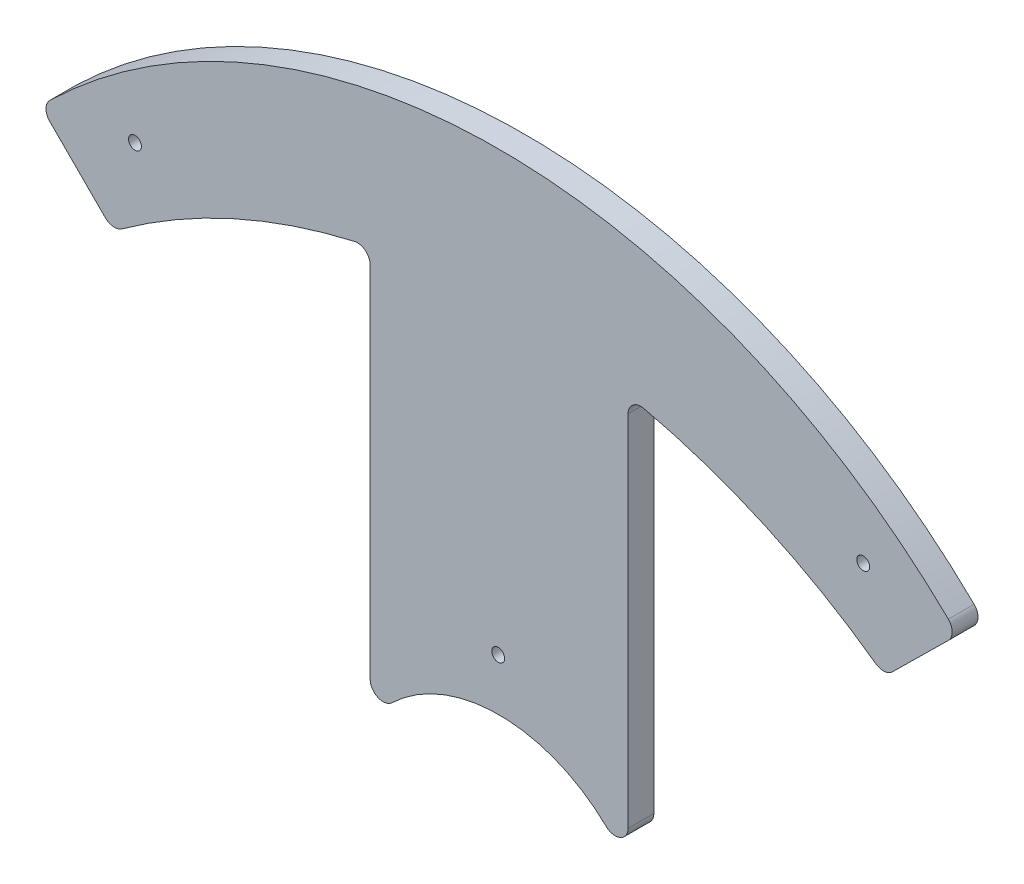
ISO-10303-21;
HEADER;
FILE_DESCRIPTION(('STEP AP214'),'2;1');
FILE_NAME('part.step','',(''),(''),'','','');
FILE_SCHEMA(('AUTOMOTIVE_DESIGN { 1 0 10303 214 1 1 1 1 }'));
ENDSEC;
DATA;
#1=APPLICATION_CONTEXT('core data for automotive mechanical design processes');
#2=APPLICATION_PROTOCOL_DEFINITION('international standard','automotive_design',2000,#1);
#3=PRODUCT_CONTEXT('',#1,'mechanical');
#4=PRODUCT('Part','Part','',(#3));
#5=PRODUCT_RELATED_PRODUCT_CATEGORY('part','',(#4));
#6=PRODUCT_DEFINITION_FORMATION('','',#4);
#7=PRODUCT_DEFINITION_CONTEXT('part definition',#1,'design');
#8=PRODUCT_DEFINITION('design','',#6,#7);
#9=PRODUCT_DEFINITION_SHAPE('','',#8);
#10=(LENGTH_UNIT() NAMED_UNIT(*) SI_UNIT(.MILLI.,.METRE.));
#11=(NAMED_UNIT(*) PLANE_ANGLE_UNIT() SI_UNIT($,.RADIAN.));
#12=(NAMED_UNIT(*) SI_UNIT($,.STERADIAN.) SOLID_ANGLE_UNIT());
#13=UNCERTAINTY_MEASURE_WITH_UNIT(LENGTH_MEASURE(1.E-05),#10,'distance_accuracy_value','');
#14=(GEOMETRIC_REPRESENTATION_CONTEXT(3) GLOBAL_UNCERTAINTY_ASSIGNED_CONTEXT((#13)) GLOBAL_UNIT_ASSIGNED_CONTEXT((#10,
#11,#12)) REPRESENTATION_CONTEXT('',''));
#15=CARTESIAN_POINT('',(0.,0.,0.));
#16=DIRECTION('',(0.,0.,1.));
#17=DIRECTION('',(1.,0.,0.));
#18=AXIS2_PLACEMENT_3D('',#15,#16,#17);
#19=CARTESIAN_POINT('',(-67.040453099182,146.054594281061,5.));
#20=DIRECTION('',(0.,0.,-1.));
#21=DIRECTION('',(-1.,0.,0.));
#22=AXIS2_PLACEMENT_3D('',#19,#20,#21);
#23=CYLINDRICAL_SURFACE('',#22,2.49999999999992);
#24=CARTESIAN_POINT('',(-67.040453099182,146.054594281061,0.));
#25=DIRECTION('',(0.,0.,1.));
#26=DIRECTION('',(1.,0.,0.));
#27=AXIS2_PLACEMENT_3D('',#24,#25,#26);
#28=CIRCLE('',#27,2.49999999999992);
#29=CARTESIAN_POINT('',(-64.5404530991821,146.054594281061,0.));
#30=VERTEX_POINT('',#29);
#31=CARTESIAN_POINT('',(-67.6017826967951,148.490761164269,0.));
#32=VERTEX_POINT('',#31);
#33=EDGE_CURVE('E204',#30,#32,#28,.T.);
#34=ORIENTED_EDGE('',*,*,#33,.F.);
#35=DIRECTION('',(0.,0.,-1.));
#36=VECTOR('',#35,1.);
#37=CARTESIAN_POINT('',(-64.5404530991821,146.054594281061,5.));
#38=LINE('',#37,#36);
#39=CARTESIAN_POINT('',(-64.5404530991821,146.054594281061,5.));
#40=VERTEX_POINT('',#39);
#41=EDGE_CURVE('E11',#40,#30,#38,.T.);
#42=ORIENTED_EDGE('',*,*,#41,.F.);
#43=CARTESIAN_POINT('',(-67.040453099182,146.054594281061,5.));
#44=DIRECTION('',(0.,0.,1.));
#45=DIRECTION('',(1.,0.,0.));
#46=AXIS2_PLACEMENT_3D('',#43,#44,#45);
#47=CIRCLE('',#46,2.49999999999992);
#48=CARTESIAN_POINT('',(-67.6017826967951,148.490761164269,5.));
#49=VERTEX_POINT('',#48);
#50=EDGE_CURVE('E398',#40,#49,#47,.T.);
#51=ORIENTED_EDGE('',*,*,#50,.T.);
#52=DIRECTION('',(0.,0.,-1.));
#53=VECTOR('',#52,1.);
#54=CARTESIAN_POINT('',(-67.6017826967951,148.490761164269,5.));
#55=LINE('',#54,#53);
#56=EDGE_CURVE('E59',#49,#32,#55,.T.);
#57=ORIENTED_EDGE('',*,*,#56,.T.);
#58=EDGE_LOOP('',(#34,#42,#51,#57));
#59=FACE_BOUND('',#58,.T.);
#60=ADVANCED_FACE('F41',(#59),#23,.F.);
#61=CARTESIAN_POINT('',(-64.5404530991821,0.,5.));
#62=DIRECTION('',(1.,0.,0.));
#63=DIRECTION('',(0.,0.,-1.));
#64=AXIS2_PLACEMENT_3D('',#61,#62,#63);
#65=PLANE('',#64);
#66=DIRECTION('',(0.,-1.,0.));
#67=VECTOR('',#66,1.);
#68=CARTESIAN_POINT('',(-64.5404530991821,0.,0.));
#69=LINE('',#68,#67);
#70=CARTESIAN_POINT('',(-64.5404530991821,76.4526738469857,0.));
#71=VERTEX_POINT('',#70);
#72=EDGE_CURVE('E207',#30,#71,#69,.T.);
#73=ORIENTED_EDGE('',*,*,#72,.T.);
#74=DIRECTION('',(0.,0.,-1.));
#75=VECTOR('',#74,1.);
#76=CARTESIAN_POINT('',(-64.5404530991821,76.4526738469857,5.));
#77=LINE('',#76,#75);
#78=CARTESIAN_POINT('',(-64.5404530991821,76.4526738469857,5.));
#79=VERTEX_POINT('',#78);
#80=EDGE_CURVE('E51',#79,#71,#77,.T.);
#81=ORIENTED_EDGE('',*,*,#80,.F.);
#82=DIRECTION('',(0.,-1.,0.));
#83=VECTOR('',#82,1.);
#84=CARTESIAN_POINT('',(-64.5404530991821,0.,5.));
#85=LINE('',#84,#83);
#86=EDGE_CURVE('E401',#40,#79,#85,.T.);
#87=ORIENTED_EDGE('',*,*,#86,.F.);
#88=ORIENTED_EDGE('',*,*,#41,.T.);
#89=EDGE_LOOP('',(#73,#81,#87,#88));
#90=FACE_BOUND('',#89,.T.);
#91=ADVANCED_FACE('F320',(#90),#65,.F.);
#92=CARTESIAN_POINT('',(-62.0404530991821,76.4526738469857,5.));
#93=DIRECTION('',(0.,0.,-1.));
#94=DIRECTION('',(-1.,0.,0.));
#95=AXIS2_PLACEMENT_3D('',#92,#93,#94);
#96=CYLINDRICAL_SURFACE('',#95,2.49999999999999);
#97=CARTESIAN_POINT('',(-62.0404530991821,76.4526738469857,0.));
#98=DIRECTION('',(0.,0.,1.));
#99=DIRECTION('',(1.,0.,0.));
#100=AXIS2_PLACEMENT_3D('',#97,#98,#99);
#101=CIRCLE('',#100,2.49999999999999);
#102=CARTESIAN_POINT('',(-60.3094368839577,74.6489047756714,0.));
#103=VERTEX_POINT('',#102);
#104=EDGE_CURVE('E211',#71,#103,#101,.T.);
#105=ORIENTED_EDGE('',*,*,#104,.T.);
#106=DIRECTION('',(0.,0.,-1.));
#107=VECTOR('',#106,1.);
#108=CARTESIAN_POINT('',(-60.3094368839577,74.6489047756714,5.));
#109=LINE('',#108,#107);
#110=CARTESIAN_POINT('',(-60.3094368839577,74.6489047756714,5.));
#111=VERTEX_POINT('',#110);
#112=EDGE_CURVE('E308',#111,#103,#109,.T.);
#113=ORIENTED_EDGE('',*,*,#112,.F.);
#114=CARTESIAN_POINT('',(-62.0404530991821,76.4526738469857,5.));
#115=DIRECTION('',(0.,0.,1.));
#116=DIRECTION('',(1.,0.,0.));
#117=AXIS2_PLACEMENT_3D('',#114,#115,#116);
#118=CIRCLE('',#117,2.49999999999999);
#119=EDGE_CURVE('E316',#79,#111,#118,.T.);
#120=ORIENTED_EDGE('',*,*,#119,.F.);
#121=ORIENTED_EDGE('',*,*,#80,.T.);
#122=EDGE_LOOP('',(#105,#113,#120,#121));
#123=FACE_BOUND('',#122,.T.);
#124=ADVANCED_FACE('F314',(#123),#96,.T.);
#125=CARTESIAN_POINT('',(-39.5421349617665,53.0087742139599,5.));
#126=DIRECTION('',(0.,0.,-1.));
#127=DIRECTION('',(-1.,0.,0.));
#128=AXIS2_PLACEMENT_3D('',#125,#126,#127);
#129=CYLINDRICAL_SURFACE('',#128,29.9929338320774);
#130=CARTESIAN_POINT('',(-39.5421349617665,53.0087742139599,0.));
#131=DIRECTION('',(0.,0.,1.));
#132=DIRECTION('',(1.,0.,0.));
#133=AXIS2_PLACEMENT_3D('',#130,#131,#132);
#134=CIRCLE('',#133,29.9929338320774);
#135=CARTESIAN_POINT('',(-18.7626844536083,74.6372396341966,0.));
#136=VERTEX_POINT('',#135);
#137=EDGE_CURVE('E215',#136,#103,#134,.T.);
#138=ORIENTED_EDGE('',*,*,#137,.F.);
#139=DIRECTION('',(0.,0.,-1.));
#140=VECTOR('',#139,1.);
#141=CARTESIAN_POINT('',(-18.7626844536083,74.6372396341966,5.));
#142=LINE('',#141,#140);
#143=CARTESIAN_POINT('',(-18.7626844536083,74.6372396341966,5.));
#144=VERTEX_POINT('',#143);
#145=EDGE_CURVE('E305',#144,#136,#142,.T.);
#146=ORIENTED_EDGE('',*,*,#145,.F.);
#147=CARTESIAN_POINT('',(-39.5421349617665,53.0087742139599,5.));
#148=DIRECTION('',(0.,0.,1.));
#149=DIRECTION('',(1.,0.,0.));
#150=AXIS2_PLACEMENT_3D('',#147,#148,#149);
#151=CIRCLE('',#150,29.9929338320774);
#152=EDGE_CURVE('E408',#144,#111,#151,.T.);
#153=ORIENTED_EDGE('',*,*,#152,.T.);
#154=ORIENTED_EDGE('',*,*,#112,.T.);
#155=EDGE_LOOP('',(#138,#146,#153,#154));
#156=FACE_BOUND('',#155,.T.);
#157=ADVANCED_FACE('F332',(#156),#129,.F.);
#158=CARTESIAN_POINT('',(-17.0306556177084,76.4400363813679,5.));
#159=DIRECTION('',(0.,0.,-1.));
#160=DIRECTION('',(-1.,0.,0.));
#161=AXIS2_PLACEMENT_3D('',#158,#159,#160);
#162=CYLINDRICAL_SURFACE('',#161,2.5);
#163=CARTESIAN_POINT('',(-17.0306556177084,76.4400363813679,0.));
#164=DIRECTION('',(0.,0.,1.));
#165=DIRECTION('',(1.,0.,0.));
#166=AXIS2_PLACEMENT_3D('',#163,#164,#165);
#167=CIRCLE('',#166,2.5);
#168=CARTESIAN_POINT('',(-14.5306556177084,76.4400363813679,0.));
#169=VERTEX_POINT('',#168);
#170=EDGE_CURVE('E219',#169,#136,#167,.F.);
#171=ORIENTED_EDGE('',*,*,#170,.F.);
#172=DIRECTION('',(0.,0.,-1.));
#173=VECTOR('',#172,1.);
#174=CARTESIAN_POINT('',(-14.5306556177084,76.4400363813679,5.));
#175=LINE('',#174,#173);
#176=CARTESIAN_POINT('',(-14.5306556177084,76.4400363813679,5.));
#177=VERTEX_POINT('',#176);
#178=EDGE_CURVE('E302',#177,#169,#175,.T.);
#179=ORIENTED_EDGE('',*,*,#178,.F.);
#180=CARTESIAN_POINT('',(-17.0306556177084,76.4400363813679,5.));
#181=DIRECTION('',(0.,0.,1.));
#182=DIRECTION('',(1.,0.,0.));
#183=AXIS2_PLACEMENT_3D('',#180,#181,#182);
#184=CIRCLE('',#183,2.5);
#185=EDGE_CURVE('E412',#177,#144,#184,.F.);
#186=ORIENTED_EDGE('',*,*,#185,.T.);
#187=ORIENTED_EDGE('',*,*,#145,.T.);
#188=EDGE_LOOP('',(#171,#179,#186,#187));
#189=FACE_BOUND('',#188,.T.);
#190=ADVANCED_FACE('F335',(#189),#162,.T.);
#191=CARTESIAN_POINT('',(-14.5306556177084,0.,5.));
#192=DIRECTION('',(1.,0.,0.));
#193=DIRECTION('',(0.,1.,0.));
#194=AXIS2_PLACEMENT_3D('',#191,#192,#193);
#195=PLANE('',#194);
#196=DIRECTION('',(0.,-1.,0.));
#197=VECTOR('',#196,1.);
#198=CARTESIAN_POINT('',(-14.5306556177084,0.,0.));
#199=LINE('',#198,#197);
#200=CARTESIAN_POINT('',(-14.5306556177084,146.054710198227,0.));
#201=VERTEX_POINT('',#200);
#202=EDGE_CURVE('E223',#201,#169,#199,.T.);
#203=ORIENTED_EDGE('',*,*,#202,.F.);
#204=DIRECTION('',(0.,0.,-1.));
#205=VECTOR('',#204,1.);
#206=CARTESIAN_POINT('',(-14.5306556177084,146.054710198227,5.));
#207=LINE('',#206,#205);
#208=CARTESIAN_POINT('',(-14.5306556177084,146.054710198227,5.));
#209=VERTEX_POINT('',#208);
#210=EDGE_CURVE('E299',#209,#201,#207,.T.);
#211=ORIENTED_EDGE('',*,*,#210,.F.);
#212=DIRECTION('',(0.,-1.,0.));
#213=VECTOR('',#212,1.);
#214=CARTESIAN_POINT('',(-14.5306556177084,0.,5.));
#215=LINE('',#214,#213);
#216=EDGE_CURVE('E416',#209,#177,#215,.T.);
#217=ORIENTED_EDGE('',*,*,#216,.T.);
#218=ORIENTED_EDGE('',*,*,#178,.T.);
#219=EDGE_LOOP('',(#203,#211,#217,#218));
#220=FACE_BOUND('',#219,.T.);
#221=ADVANCED_FACE('F339',(#220),#195,.T.);
#222=CARTESIAN_POINT('',(-12.0306556177085,146.054710198227,5.));
#223=DIRECTION('',(0.,0.,-1.));
#224=DIRECTION('',(-1.,0.,0.));
#225=AXIS2_PLACEMENT_3D('',#222,#223,#224);
#226=CYLINDRICAL_SURFACE('',#225,2.49999999999989);
#227=CARTESIAN_POINT('',(-12.0306556177085,146.054710198227,0.));
#228=DIRECTION('',(0.,0.,1.));
#229=DIRECTION('',(1.,0.,0.));
#230=AXIS2_PLACEMENT_3D('',#227,#228,#229);
#231=CIRCLE('',#230,2.49999999999989);
#232=CARTESIAN_POINT('',(-11.4693362871283,148.490879447093,0.));
#233=VERTEX_POINT('',#232);
#234=EDGE_CURVE('E227',#233,#201,#231,.T.);
#235=ORIENTED_EDGE('',*,*,#234,.F.);
#236=DIRECTION('',(0.,0.,-1.));
#237=VECTOR('',#236,1.);
#238=CARTESIAN_POINT('',(-11.4693362871283,148.490879447093,5.));
#239=LINE('',#238,#237);
#240=CARTESIAN_POINT('',(-11.4693362871283,148.490879447093,5.));
#241=VERTEX_POINT('',#240);
#242=EDGE_CURVE('E296',#241,#233,#239,.T.);
#243=ORIENTED_EDGE('',*,*,#242,.F.);
#244=CARTESIAN_POINT('',(-12.0306556177085,146.054710198227,5.));
#245=DIRECTION('',(0.,0.,1.));
#246=DIRECTION('',(1.,0.,0.));
#247=AXIS2_PLACEMENT_3D('',#244,#245,#246);
#248=CIRCLE('',#247,2.49999999999989);
#249=EDGE_CURVE('E420',#241,#209,#248,.T.);
#250=ORIENTED_EDGE('',*,*,#249,.T.);
#251=ORIENTED_EDGE('',*,*,#210,.T.);
#252=EDGE_LOOP('',(#235,#243,#250,#251));
#253=FACE_BOUND('',#252,.T.);
#254=ADVANCED_FACE('F343',(#253),#226,.F.);
#255=CARTESIAN_POINT('',(-39.5353028161393,26.6824170038267,5.));
#256=DIRECTION('',(0.,0.,-1.));
#257=DIRECTION('',(-1.,0.,0.));
#258=AXIS2_PLACEMENT_3D('',#255,#256,#257);
#259=CYLINDRICAL_SURFACE('',#258,125.);
#260=CARTESIAN_POINT('',(-39.5353028161393,26.6824170038267,0.));
#261=DIRECTION('',(0.,0.,1.));
#262=DIRECTION('',(1.,0.,0.));
#263=AXIS2_PLACEMENT_3D('',#260,#261,#262);
#264=CIRCLE('',#263,125.);
#265=CARTESIAN_POINT('',(33.5183803276409,128.112981328039,0.));
#266=VERTEX_POINT('',#265);
#267=EDGE_CURVE('E231',#266,#233,#264,.T.);
#268=ORIENTED_EDGE('',*,*,#267,.F.);
#269=DIRECTION('',(0.,0.,-1.));
#270=VECTOR('',#269,1.);
#271=CARTESIAN_POINT('',(33.5183803276409,128.112981328039,5.));
#272=LINE('',#271,#270);
#273=CARTESIAN_POINT('',(33.5183803276409,128.112981328039,5.));
#274=VERTEX_POINT('',#273);
#275=EDGE_CURVE('E293',#274,#266,#272,.T.);
#276=ORIENTED_EDGE('',*,*,#275,.F.);
#277=CARTESIAN_POINT('',(-39.5353028161393,26.6824170038267,5.));
#278=DIRECTION('',(0.,0.,1.));
#279=DIRECTION('',(1.,0.,0.));
#280=AXIS2_PLACEMENT_3D('',#277,#278,#279);
#281=CIRCLE('',#280,125.);
#282=EDGE_CURVE('E424',#274,#241,#281,.T.);
#283=ORIENTED_EDGE('',*,*,#282,.T.);
#284=ORIENTED_EDGE('',*,*,#242,.T.);
#285=EDGE_LOOP('',(#268,#276,#283,#284));
#286=FACE_BOUND('',#285,.T.);
#287=ADVANCED_FACE('F347',(#286),#259,.F.);
#288=CARTESIAN_POINT('',(34.9794539905165,130.141592614523,5.));
#289=DIRECTION('',(0.,0.,-1.));
#290=DIRECTION('',(-1.,0.,0.));
#291=AXIS2_PLACEMENT_3D('',#288,#289,#290);
#292=CYLINDRICAL_SURFACE('',#291,2.49999999999988);
#293=CARTESIAN_POINT('',(34.9794539905165,130.141592614523,0.));
#294=DIRECTION('',(0.,0.,1.));
#295=DIRECTION('',(1.,0.,0.));
#296=AXIS2_PLACEMENT_3D('',#293,#294,#295);
#297=CIRCLE('',#296,2.49999999999988);
#298=CARTESIAN_POINT('',(36.7346989924656,128.361391787894,0.));
#299=VERTEX_POINT('',#298);
#300=EDGE_CURVE('E235',#299,#266,#297,.F.);
#301=ORIENTED_EDGE('',*,*,#300,.F.);
#302=DIRECTION('',(0.,0.,-1.));
#303=VECTOR('',#302,1.);
#304=CARTESIAN_POINT('',(36.7346989924656,128.361391787894,5.));
#305=LINE('',#304,#303);
#306=CARTESIAN_POINT('',(36.7346989924656,128.361391787894,5.));
#307=VERTEX_POINT('',#306);
#308=EDGE_CURVE('E290',#307,#299,#305,.T.);
#309=ORIENTED_EDGE('',*,*,#308,.F.);
#310=CARTESIAN_POINT('',(34.9794539905165,130.141592614523,5.));
#311=DIRECTION('',(0.,0.,1.));
#312=DIRECTION('',(1.,0.,0.));
#313=AXIS2_PLACEMENT_3D('',#310,#311,#312);
#314=CIRCLE('',#313,2.49999999999988);
#315=EDGE_CURVE('E428',#307,#274,#314,.F.);
#316=ORIENTED_EDGE('',*,*,#315,.T.);
#317=ORIENTED_EDGE('',*,*,#275,.T.);
#318=EDGE_LOOP('',(#301,#309,#316,#317));
#319=FACE_BOUND('',#318,.T.);
#320=ADVANCED_FACE('F351',(#319),#292,.T.);
#321=CARTESIAN_POINT('',(-46.0662390899346,46.721202348698,5.));
#322=DIRECTION('',(-0.702098000779698,0.712080330651782,0.));
#323=DIRECTION('',(-0.712080330651782,-0.702098000779698,0.));
#324=AXIS2_PLACEMENT_3D('',#321,#322,#323);
#325=PLANE('',#324);
#326=DIRECTION('',(0.712080330651782,0.702098000779698,0.));
#327=VECTOR('',#326,1.);
#328=CARTESIAN_POINT('',(-46.0662390899346,46.721202348698,0.));
#329=LINE('',#328,#327);
#330=CARTESIAN_POINT('',(47.5954760632514,139.069916570952,0.));
#331=VERTEX_POINT('',#330);
#332=EDGE_CURVE('E239',#299,#331,#329,.T.);
#333=ORIENTED_EDGE('',*,*,#332,.T.);
#334=DIRECTION('',(0.,0.,-1.));
#335=VECTOR('',#334,1.);
#336=CARTESIAN_POINT('',(47.5954760632514,139.069916570952,5.));
#337=LINE('',#336,#335);
#338=CARTESIAN_POINT('',(47.5954760632514,139.069916570952,5.));
#339=VERTEX_POINT('',#338);
#340=EDGE_CURVE('E286',#339,#331,#337,.T.);
#341=ORIENTED_EDGE('',*,*,#340,.F.);
#342=DIRECTION('',(0.712080330651782,0.702098000779698,0.));
#343=VECTOR('',#342,1.);
#344=CARTESIAN_POINT('',(-46.0662390899346,46.721202348698,5.));
#345=LINE('',#344,#343);
#346=EDGE_CURVE('E432',#307,#339,#345,.T.);
#347=ORIENTED_EDGE('',*,*,#346,.F.);
#348=ORIENTED_EDGE('',*,*,#308,.T.);
#349=EDGE_LOOP('',(#333,#341,#347,#348));
#350=FACE_BOUND('',#349,.T.);
#351=ADVANCED_FACE('F355',(#350),#325,.F.);
#352=CARTESIAN_POINT('',(45.8402310613022,140.850117397581,5.));
#353=DIRECTION('',(0.,0.,-1.));
#354=DIRECTION('',(-1.,0.,0.));
#355=AXIS2_PLACEMENT_3D('',#352,#353,#354);
#356=CYLINDRICAL_SURFACE('',#355,2.49999999999987);
#357=CARTESIAN_POINT('',(45.8402310613022,140.850117397581,0.));
#358=DIRECTION('',(0.,0.,1.));
#359=DIRECTION('',(1.,0.,0.));
#360=AXIS2_PLACEMENT_3D('',#357,#358,#359);
#361=CIRCLE('',#360,2.49999999999987);
#362=CARTESIAN_POINT('',(47.5827283270791,142.642797870716,0.));
#363=VERTEX_POINT('',#362);
#364=EDGE_CURVE('E243',#331,#363,#361,.T.);
#365=ORIENTED_EDGE('',*,*,#364,.T.);
#366=DIRECTION('',(0.,0.,-1.));
#367=VECTOR('',#366,1.);
#368=CARTESIAN_POINT('',(47.5827283270791,142.642797870716,5.));
#369=LINE('',#368,#367);
#370=CARTESIAN_POINT('',(47.5827283270791,142.642797870716,5.));
#371=VERTEX_POINT('',#370);
#372=EDGE_CURVE('E282',#371,#363,#369,.T.);
#373=ORIENTED_EDGE('',*,*,#372,.F.);
#374=CARTESIAN_POINT('',(45.8402310613022,140.850117397581,5.));
#375=DIRECTION('',(0.,0.,1.));
#376=DIRECTION('',(1.,0.,0.));
#377=AXIS2_PLACEMENT_3D('',#374,#375,#376);
#378=CIRCLE('',#377,2.49999999999987);
#379=EDGE_CURVE('E436',#339,#371,#378,.T.);
#380=ORIENTED_EDGE('',*,*,#379,.F.);
#381=ORIENTED_EDGE('',*,*,#340,.T.);
#382=EDGE_LOOP('',(#365,#373,#380,#381));
#383=FACE_BOUND('',#382,.T.);
#384=ADVANCED_FACE('F359',(#383),#356,.T.);
#385=CARTESIAN_POINT('',(-39.5421349617665,53.0087742139599,5.));
#386=DIRECTION('',(0.,0.,-1.));
#387=DIRECTION('',(-1.,0.,0.));
#388=AXIS2_PLACEMENT_3D('',#385,#386,#387);
#389=CYLINDRICAL_SURFACE('',#388,125.);
#390=CARTESIAN_POINT('',(-39.5421349617665,53.0087742139599,0.));
#391=DIRECTION('',(0.,0.,1.));
#392=DIRECTION('',(1.,0.,0.));
#393=AXIS2_PLACEMENT_3D('',#390,#391,#392);
#394=CIRCLE('',#393,125.);
#395=CARTESIAN_POINT('',(-126.659999819408,142.649599860791,0.));
#396=VERTEX_POINT('',#395);
#397=EDGE_CURVE('E247',#363,#396,#394,.T.);
#398=ORIENTED_EDGE('',*,*,#397,.T.);
#399=DIRECTION('',(0.,0.,-1.));
#400=VECTOR('',#399,1.);
#401=CARTESIAN_POINT('',(-126.659999819408,142.649599860791,5.));
#402=LINE('',#401,#400);
#403=CARTESIAN_POINT('',(-126.659999819408,142.649599860791,5.));
#404=VERTEX_POINT('',#403);
#405=EDGE_CURVE('E279',#404,#396,#402,.T.);
#406=ORIENTED_EDGE('',*,*,#405,.F.);
#407=CARTESIAN_POINT('',(-39.5421349617665,53.0087742139599,5.));
#408=DIRECTION('',(0.,0.,1.));
#409=DIRECTION('',(1.,0.,0.));
#410=AXIS2_PLACEMENT_3D('',#407,#408,#409);
#411=CIRCLE('',#410,125.);
#412=EDGE_CURVE('E186',#371,#404,#411,.T.);
#413=ORIENTED_EDGE('',*,*,#412,.F.);
#414=ORIENTED_EDGE('',*,*,#372,.T.);
#415=EDGE_LOOP('',(#398,#406,#413,#414));
#416=FACE_BOUND('',#415,.T.);
#417=ADVANCED_FACE('F363',(#416),#389,.T.);
#418=CARTESIAN_POINT('',(-124.917642522256,140.856783347855,5.));
#419=DIRECTION('',(0.,0.,-1.));
#420=DIRECTION('',(-1.,0.,0.));
#421=AXIS2_PLACEMENT_3D('',#418,#419,#420);
#422=CYLINDRICAL_SURFACE('',#421,2.49999999999991);
#423=CARTESIAN_POINT('',(-124.917642522256,140.856783347855,0.));
#424=DIRECTION('',(0.,0.,1.));
#425=DIRECTION('',(1.,0.,0.));
#426=AXIS2_PLACEMENT_3D('',#423,#424,#425);
#427=CIRCLE('',#426,2.49999999999991);
#428=CARTESIAN_POINT('',(-126.685409475222,139.089016394889,0.));
#429=VERTEX_POINT('',#428);
#430=EDGE_CURVE('E251',#429,#396,#427,.F.);
#431=ORIENTED_EDGE('',*,*,#430,.F.);
#432=DIRECTION('',(0.,0.,-1.));
#433=VECTOR('',#432,1.);
#434=CARTESIAN_POINT('',(-126.685409475222,139.089016394889,5.));
#435=LINE('',#434,#433);
#436=CARTESIAN_POINT('',(-126.685409475222,139.089016394889,5.));
#437=VERTEX_POINT('',#436);
#438=EDGE_CURVE('E168',#437,#429,#435,.T.);
#439=ORIENTED_EDGE('',*,*,#438,.F.);
#440=CARTESIAN_POINT('',(-124.917642522256,140.856783347855,5.));
#441=DIRECTION('',(0.,0.,1.));
#442=DIRECTION('',(1.,0.,0.));
#443=AXIS2_PLACEMENT_3D('',#440,#441,#442);
#444=CIRCLE('',#443,2.49999999999991);
#445=EDGE_CURVE('E182',#437,#404,#444,.F.);
#446=ORIENTED_EDGE('',*,*,#445,.T.);
#447=ORIENTED_EDGE('',*,*,#405,.T.);
#448=EDGE_LOOP('',(#431,#439,#446,#447));
#449=FACE_BOUND('',#448,.T.);
#450=ADVANCED_FACE('F367',(#449),#422,.T.);
#451=CARTESIAN_POINT('',(6.2018034598328,6.20180345983275,5.));
#452=DIRECTION('',(-0.707106781186551,-0.707106781186544,0.));
#453=DIRECTION('',(0.707106781186544,-0.707106781186551,0.));
#454=AXIS2_PLACEMENT_3D('',#451,#452,#453);
#455=PLANE('',#454);
#456=DIRECTION('',(-0.707106781186544,0.707106781186551,0.));
#457=VECTOR('',#456,1.);
#458=CARTESIAN_POINT('',(6.2018034598328,6.20180345983275,0.));
#459=LINE('',#458,#457);
#460=CARTESIAN_POINT('',(-115.906381169613,128.30998808928,0.));
#461=VERTEX_POINT('',#460);
#462=EDGE_CURVE('E164',#461,#429,#459,.T.);
#463=ORIENTED_EDGE('',*,*,#462,.F.);
#464=DIRECTION('',(0.,0.,-1.));
#465=VECTOR('',#464,1.);
#466=CARTESIAN_POINT('',(-115.906381169613,128.30998808928,5.));
#467=LINE('',#466,#465);
#468=CARTESIAN_POINT('',(-115.906381169613,128.30998808928,5.));
#469=VERTEX_POINT('',#468);
#470=EDGE_CURVE('E158',#469,#461,#467,.T.);
#471=ORIENTED_EDGE('',*,*,#470,.F.);
#472=DIRECTION('',(-0.707106781186544,0.707106781186551,0.));
#473=VECTOR('',#472,1.);
#474=CARTESIAN_POINT('',(6.2018034598328,6.20180345983275,5.));
#475=LINE('',#474,#473);
#476=EDGE_CURVE('E162',#469,#437,#475,.T.);
#477=ORIENTED_EDGE('',*,*,#476,.T.);
#478=ORIENTED_EDGE('',*,*,#438,.T.);
#479=EDGE_LOOP('',(#463,#471,#477,#478));
#480=FACE_BOUND('',#479,.T.);
#481=ADVANCED_FACE('F160',(#480),#455,.T.);
#482=CARTESIAN_POINT('',(-114.138614216646,130.077755042246,5.));
#483=DIRECTION('',(0.,0.,-1.));
#484=DIRECTION('',(-1.,0.,0.));
#485=AXIS2_PLACEMENT_3D('',#482,#483,#484);
#486=CYLINDRICAL_SURFACE('',#485,2.50000000000016);
#487=CARTESIAN_POINT('',(-114.138614216646,130.077755042246,0.));
#488=DIRECTION('',(0.,0.,1.));
#489=DIRECTION('',(1.,0.,0.));
#490=AXIS2_PLACEMENT_3D('',#487,#488,#489);
#491=CIRCLE('',#490,2.50000000000016);
#492=CARTESIAN_POINT('',(-112.675804189186,128.050395472865,0.));
#493=VERTEX_POINT('',#492);
#494=EDGE_CURVE('E257',#461,#493,#491,.T.);
#495=ORIENTED_EDGE('',*,*,#494,.T.);
#496=DIRECTION('',(0.,0.,-1.));
#497=VECTOR('',#496,1.);
#498=CARTESIAN_POINT('',(-112.675804189186,128.050395472865,5.));
#499=LINE('',#498,#497);
#500=CARTESIAN_POINT('',(-112.675804189186,128.050395472865,5.));
#501=VERTEX_POINT('',#500);
#502=EDGE_CURVE('E109',#501,#493,#499,.T.);
#503=ORIENTED_EDGE('',*,*,#502,.F.);
#504=CARTESIAN_POINT('',(-114.138614216646,130.077755042246,5.));
#505=DIRECTION('',(0.,0.,1.));
#506=DIRECTION('',(1.,0.,0.));
#507=AXIS2_PLACEMENT_3D('',#504,#505,#506);
#508=CIRCLE('',#507,2.50000000000016);
#509=EDGE_CURVE('E170',#469,#501,#508,.T.);
#510=ORIENTED_EDGE('',*,*,#509,.F.);
#511=ORIENTED_EDGE('',*,*,#470,.T.);
#512=EDGE_LOOP('',(#495,#503,#510,#511));
#513=FACE_BOUND('',#512,.T.);
#514=ADVANCED_FACE('F171',(#513),#486,.T.);
#515=CARTESIAN_POINT('',(-110.157771622449,143.774581977712,5.));
#516=DIRECTION('',(0.,0.,-1.));
#517=DIRECTION('',(-1.,0.,0.));
#518=AXIS2_PLACEMENT_3D('',#515,#516,#517);
#519=CYLINDRICAL_SURFACE('',#518,1.25000000000052);
#520=CARTESIAN_POINT('',(-110.157771622449,143.774581977712,5.));
#521=DIRECTION('',(0.,0.,1.));
#522=DIRECTION('',(1.,0.,0.));
#523=AXIS2_PLACEMENT_3D('',#520,#521,#522);
#524=CIRCLE('',#523,1.25000000000052);
#525=CARTESIAN_POINT('',(-108.907771622449,143.774581977712,5.));
#526=VERTEX_POINT('',#525);
#527=EDGE_CURVE('E192',#526,#526,#524,.T.);
#528=ORIENTED_EDGE('',*,*,#527,.T.);
#529=EDGE_LOOP('',(#528));
#530=FACE_BOUND('',#529,.T.);
#531=CARTESIAN_POINT('',(-110.157771622449,143.774581977712,0.));
#532=DIRECTION('',(0.,0.,1.));
#533=DIRECTION('',(1.,0.,0.));
#534=AXIS2_PLACEMENT_3D('',#531,#532,#533);
#535=CIRCLE('',#534,1.25000000000052);
#536=CARTESIAN_POINT('',(-108.907771622449,143.774581977712,0.));
#537=VERTEX_POINT('',#536);
#538=EDGE_CURVE('E264',#537,#537,#535,.T.);
#539=ORIENTED_EDGE('',*,*,#538,.F.);
#540=EDGE_LOOP('',(#539));
#541=FACE_BOUND('',#540,.T.);
#542=ADVANCED_FACE('F376',(#530,#541),#519,.F.);
#543=CARTESIAN_POINT('',(-39.5353028161393,26.6824170038267,5.));
#544=DIRECTION('',(0.,0.,-1.));
#545=DIRECTION('',(-1.,0.,0.));
#546=AXIS2_PLACEMENT_3D('',#543,#544,#545);
#547=CYLINDRICAL_SURFACE('',#546,125.);
#548=CARTESIAN_POINT('',(-39.5353028161393,26.6824170038267,0.));
#549=DIRECTION('',(0.,0.,1.));
#550=DIRECTION('',(1.,0.,0.));
#551=AXIS2_PLACEMENT_3D('',#548,#549,#550);
#552=CIRCLE('',#551,125.);
#553=EDGE_CURVE('E260',#32,#493,#552,.T.);
#554=ORIENTED_EDGE('',*,*,#553,.F.);
#555=ORIENTED_EDGE('',*,*,#56,.F.);
#556=CARTESIAN_POINT('',(-39.5353028161393,26.6824170038267,5.));
#557=DIRECTION('',(0.,0.,1.));
#558=DIRECTION('',(1.,0.,0.));
#559=AXIS2_PLACEMENT_3D('',#556,#557,#558);
#560=CIRCLE('',#559,125.);
#561=EDGE_CURVE('E175',#49,#501,#560,.T.);
#562=ORIENTED_EDGE('',*,*,#561,.T.);
#563=ORIENTED_EDGE('',*,*,#502,.T.);
#564=EDGE_LOOP('',(#554,#555,#562,#563));
#565=FACE_BOUND('',#564,.T.);
#566=ADVANCED_FACE('F377',(#565),#547,.F.);
#567=CARTESIAN_POINT('',(-39.7176323202739,92.9924170038271,5.));
#568=DIRECTION('',(0.,0.,-1.));
#569=DIRECTION('',(-1.,0.,0.));
#570=AXIS2_PLACEMENT_3D('',#567,#568,#569);
#571=CYLINDRICAL_SURFACE('',#570,1.25);
#572=CARTESIAN_POINT('',(-39.7176323202739,92.9924170038271,5.));
#573=DIRECTION('',(0.,0.,1.));
#574=DIRECTION('',(1.,0.,0.));
#575=AXIS2_PLACEMENT_3D('',#572,#573,#574);
#576=CIRCLE('',#575,1.25);
#577=CARTESIAN_POINT('',(-38.4676323202739,92.9924170038271,5.));
#578=VERTEX_POINT('',#577);
#579=EDGE_CURVE('E272',#578,#578,#576,.T.);
#580=ORIENTED_EDGE('',*,*,#579,.T.);
#581=EDGE_LOOP('',(#580));
#582=FACE_BOUND('',#581,.T.);
#583=CARTESIAN_POINT('',(-39.7176323202739,92.9924170038271,0.));
#584=DIRECTION('',(0.,0.,1.));
#585=DIRECTION('',(1.,0.,0.));
#586=AXIS2_PLACEMENT_3D('',#583,#584,#585);
#587=CIRCLE('',#586,1.25);
#588=CARTESIAN_POINT('',(-38.4676323202739,92.9924170038271,0.));
#589=VERTEX_POINT('',#588);
#590=EDGE_CURVE('E200',#589,#589,#587,.T.);
#591=ORIENTED_EDGE('',*,*,#590,.F.);
#592=EDGE_LOOP('',(#591));
#593=FACE_BOUND('',#592,.T.);
#594=ADVANCED_FACE('F43',(#582,#593),#571,.F.);
#595=CARTESIAN_POINT('',(31.0735016989158,143.774581977713,5.));
#596=DIRECTION('',(0.,0.,-1.));
#597=DIRECTION('',(-1.,0.,0.));
#598=AXIS2_PLACEMENT_3D('',#595,#596,#597);
#599=CYLINDRICAL_SURFACE('',#598,1.25);
#600=CARTESIAN_POINT('',(31.0735016989158,143.774581977713,5.));
#601=DIRECTION('',(0.,0.,1.));
#602=DIRECTION('',(1.,0.,0.));
#603=AXIS2_PLACEMENT_3D('',#600,#601,#602);
#604=CIRCLE('',#603,1.25);
#605=CARTESIAN_POINT('',(32.3235016989158,143.774581977713,5.));
#606=VERTEX_POINT('',#605);
#607=EDGE_CURVE('E196',#606,#606,#604,.F.);
#608=ORIENTED_EDGE('',*,*,#607,.F.);
#609=EDGE_LOOP('',(#608));
#610=FACE_BOUND('',#609,.T.);
#611=CARTESIAN_POINT('',(31.0735016989158,143.774581977713,0.));
#612=DIRECTION('',(0.,0.,1.));
#613=DIRECTION('',(1.,0.,0.));
#614=AXIS2_PLACEMENT_3D('',#611,#612,#613);
#615=CIRCLE('',#614,1.25);
#616=CARTESIAN_POINT('',(32.3235016989158,143.774581977713,0.));
#617=VERTEX_POINT('',#616);
#618=EDGE_CURVE('E268',#617,#617,#615,.F.);
#619=ORIENTED_EDGE('',*,*,#618,.T.);
#620=EDGE_LOOP('',(#619));
#621=FACE_BOUND('',#620,.T.);
#622=ADVANCED_FACE('F383',(#610,#621),#599,.F.);
#623=CARTESIAN_POINT('',(0.,0.,5.));
#624=DIRECTION('',(0.,0.,1.));
#625=DIRECTION('',(1.,0.,0.));
#626=AXIS2_PLACEMENT_3D('',#623,#624,#625);
#627=PLANE('',#626);
#628=ORIENTED_EDGE('',*,*,#579,.F.);
#629=EDGE_LOOP('',(#628));
#630=FACE_BOUND('',#629,.T.);
#631=ORIENTED_EDGE('',*,*,#50,.F.);
#632=ORIENTED_EDGE('',*,*,#86,.T.);
#633=ORIENTED_EDGE('',*,*,#119,.T.);
#634=ORIENTED_EDGE('',*,*,#152,.F.);
#635=ORIENTED_EDGE('',*,*,#185,.F.);
#636=ORIENTED_EDGE('',*,*,#216,.F.);
#637=ORIENTED_EDGE('',*,*,#249,.F.);
#638=ORIENTED_EDGE('',*,*,#282,.F.);
#639=ORIENTED_EDGE('',*,*,#315,.F.);
#640=ORIENTED_EDGE('',*,*,#346,.T.);
#641=ORIENTED_EDGE('',*,*,#379,.T.);
#642=ORIENTED_EDGE('',*,*,#412,.T.);
#643=ORIENTED_EDGE('',*,*,#445,.F.);
#644=ORIENTED_EDGE('',*,*,#476,.F.);
#645=ORIENTED_EDGE('',*,*,#509,.T.);
#646=ORIENTED_EDGE('',*,*,#561,.F.);
#647=EDGE_LOOP('',(#631,#632,#633,#634,#635,#636,#637,#638,#639,#640,#641,#642,#643,#644,#645,#646));
#648=FACE_BOUND('',#647,.T.);
#649=ORIENTED_EDGE('',*,*,#527,.F.);
#650=EDGE_LOOP('',(#649));
#651=FACE_BOUND('',#650,.T.);
#652=ORIENTED_EDGE('',*,*,#607,.T.);
#653=EDGE_LOOP('',(#652));
#654=FACE_BOUND('',#653,.T.);
#655=ADVANCED_FACE('F179',(#630,#648,#651,#654),#627,.T.);
#656=CARTESIAN_POINT('',(0.,0.,0.));
#657=DIRECTION('',(0.,0.,1.));
#658=DIRECTION('',(1.,0.,0.));
#659=AXIS2_PLACEMENT_3D('',#656,#657,#658);
#660=PLANE('',#659);
#661=ORIENTED_EDGE('',*,*,#590,.T.);
#662=EDGE_LOOP('',(#661));
#663=FACE_BOUND('',#662,.T.);
#664=ORIENTED_EDGE('',*,*,#33,.T.);
#665=ORIENTED_EDGE('',*,*,#553,.T.);
#666=ORIENTED_EDGE('',*,*,#494,.F.);
#667=ORIENTED_EDGE('',*,*,#462,.T.);
#668=ORIENTED_EDGE('',*,*,#430,.T.);
#669=ORIENTED_EDGE('',*,*,#397,.F.);
#670=ORIENTED_EDGE('',*,*,#364,.F.);
#671=ORIENTED_EDGE('',*,*,#332,.F.);
#672=ORIENTED_EDGE('',*,*,#300,.T.);
#673=ORIENTED_EDGE('',*,*,#267,.T.);
#674=ORIENTED_EDGE('',*,*,#234,.T.);
#675=ORIENTED_EDGE('',*,*,#202,.T.);
#676=ORIENTED_EDGE('',*,*,#170,.T.);
#677=ORIENTED_EDGE('',*,*,#137,.T.);
#678=ORIENTED_EDGE('',*,*,#104,.F.);
#679=ORIENTED_EDGE('',*,*,#72,.F.);
#680=EDGE_LOOP('',(#664,#665,#666,#667,#668,#669,#670,#671,#672,#673,#674,#675,#676,#677,#678,#679));
#681=FACE_BOUND('',#680,.T.);
#682=ORIENTED_EDGE('',*,*,#538,.T.);
#683=EDGE_LOOP('',(#682));
#684=FACE_BOUND('',#683,.T.);
#685=ORIENTED_EDGE('',*,*,#618,.F.);
#686=EDGE_LOOP('',(#685));
#687=FACE_BOUND('',#686,.T.);
#688=ADVANCED_FACE('F322',(#663,#681,#684,#687),#660,.F.);
#689=CLOSED_SHELL('',(#60,#91,#124,#157,#190,#221,#254,#287,#320,#351,#384,#417,#450,#481,#514,
#542,#566,#594,#622,#655,#688));
#690=MANIFOLD_SOLID_BREP('B2',#689);
#691=ADVANCED_BREP_SHAPE_REPRESENTATION('',(#18,#690),#14);
#692=SHAPE_DEFINITION_REPRESENTATION(#9,#691);
ENDSEC;
END-ISO-10303-21;
